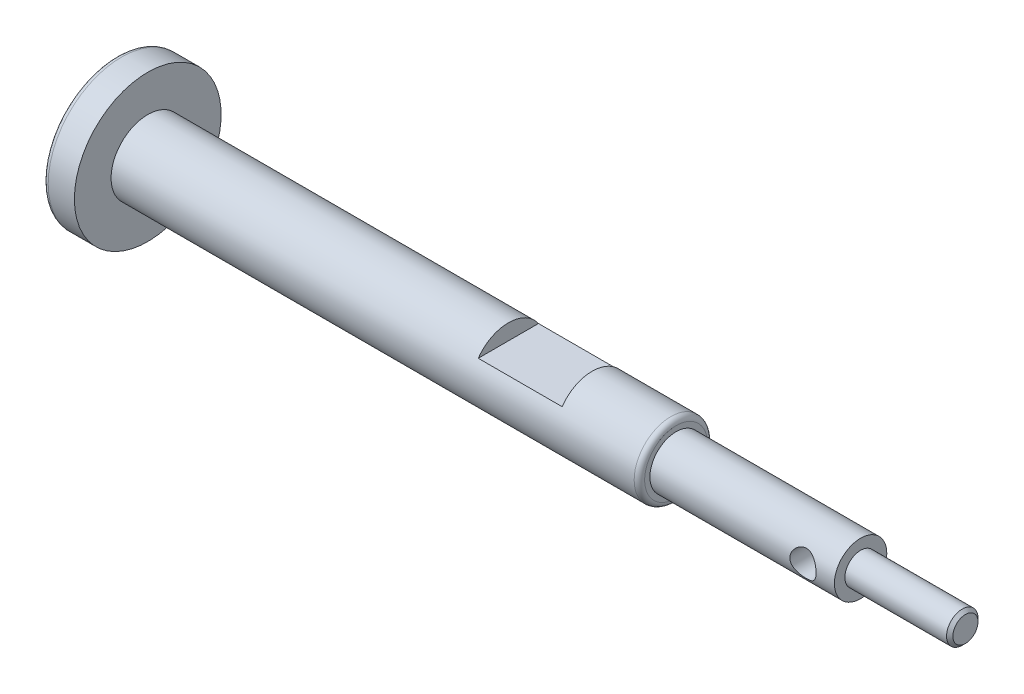
ISO-10303-21;
HEADER;
FILE_DESCRIPTION(('STEP AP214'),'2;1');
FILE_NAME('part.step','',(''),(''),'','','');
FILE_SCHEMA(('AUTOMOTIVE_DESIGN { 1 0 10303 214 1 1 1 1 }'));
ENDSEC;
DATA;
#1=APPLICATION_CONTEXT('core data for automotive mechanical design processes');
#2=APPLICATION_PROTOCOL_DEFINITION('international standard','automotive_design',2000,#1);
#3=PRODUCT_CONTEXT('',#1,'mechanical');
#4=PRODUCT('Part','Part','',(#3));
#5=PRODUCT_RELATED_PRODUCT_CATEGORY('part','',(#4));
#6=PRODUCT_DEFINITION_FORMATION('','',#4);
#7=PRODUCT_DEFINITION_CONTEXT('part definition',#1,'design');
#8=PRODUCT_DEFINITION('design','',#6,#7);
#9=PRODUCT_DEFINITION_SHAPE('','',#8);
#10=(LENGTH_UNIT() NAMED_UNIT(*) SI_UNIT(.MILLI.,.METRE.));
#11=(NAMED_UNIT(*) PLANE_ANGLE_UNIT() SI_UNIT($,.RADIAN.));
#12=(NAMED_UNIT(*) SI_UNIT($,.STERADIAN.) SOLID_ANGLE_UNIT());
#13=UNCERTAINTY_MEASURE_WITH_UNIT(LENGTH_MEASURE(1.E-05),#10,'distance_accuracy_value','');
#14=(GEOMETRIC_REPRESENTATION_CONTEXT(3) GLOBAL_UNCERTAINTY_ASSIGNED_CONTEXT((#13)) GLOBAL_UNIT_ASSIGNED_CONTEXT((#10,
#11,#12)) REPRESENTATION_CONTEXT('',''));
#15=CARTESIAN_POINT('',(0.,0.,0.));
#16=DIRECTION('',(0.,0.,1.));
#17=DIRECTION('',(1.,0.,0.));
#18=AXIS2_PLACEMENT_3D('',#15,#16,#17);
#19=CARTESIAN_POINT('',(68.,0.,0.));
#20=DIRECTION('',(1.,0.,0.));
#21=DIRECTION('',(0.,0.,-1.));
#22=AXIS2_PLACEMENT_3D('',#19,#20,#21);
#23=CYLINDRICAL_SURFACE('',#22,1.5);
#24=CARTESIAN_POINT('',(77.7,0.,0.));
#25=DIRECTION('',(1.,0.,0.));
#26=DIRECTION('',(0.,0.,-1.));
#27=AXIS2_PLACEMENT_3D('',#24,#25,#26);
#28=CIRCLE('',#27,1.5);
#29=CARTESIAN_POINT('',(77.7,0.,-1.5));
#30=VERTEX_POINT('',#29);
#31=EDGE_CURVE('E42',#30,#30,#28,.F.);
#32=ORIENTED_EDGE('',*,*,#31,.T.);
#33=EDGE_LOOP('',(#32));
#34=FACE_BOUND('',#33,.T.);
#35=CARTESIAN_POINT('',(68.,0.,0.));
#36=DIRECTION('',(1.,0.,0.));
#37=DIRECTION('',(0.,0.,-1.));
#38=AXIS2_PLACEMENT_3D('',#35,#36,#37);
#39=CIRCLE('',#38,1.5);
#40=CARTESIAN_POINT('',(68.,0.,-1.5));
#41=VERTEX_POINT('',#40);
#42=EDGE_CURVE('E137',#41,#41,#39,.T.);
#43=ORIENTED_EDGE('',*,*,#42,.T.);
#44=EDGE_LOOP('',(#43));
#45=FACE_BOUND('',#44,.T.);
#46=ADVANCED_FACE('F34',(#34,#45),#23,.T.);
#47=CARTESIAN_POINT('',(34.4,0.,0.));
#48=DIRECTION('',(-1.,0.,0.));
#49=DIRECTION('',(0.,0.,1.));
#50=AXIS2_PLACEMENT_3D('',#47,#48,#49);
#51=CYLINDRICAL_SURFACE('',#50,2.5);
#52=CARTESIAN_POINT('',(66.25,0.,2.5));
#53=CARTESIAN_POINT('',(66.2499958721006,0.0657149536912323,2.49999641755188));
#54=CARTESIAN_POINT('',(66.2447874085979,0.131508249622539,2.49738113774397));
#55=CARTESIAN_POINT('',(66.2241838995739,0.26115029408553,2.48717695046745));
#56=CARTESIAN_POINT('',(66.2087695087529,0.324995108391878,2.47957859786229));
#57=CARTESIAN_POINT('',(66.168507739229,0.448666931100717,2.46020349254139));
#58=CARTESIAN_POINT('',(66.14369701969,0.508508503673975,2.448442989719));
#59=CARTESIAN_POINT('',(66.0855367232938,0.623090771008206,2.42182220644723));
#60=CARTESIAN_POINT('',(66.0521878196889,0.677831867487562,2.40696217041912));
#61=CARTESIAN_POINT('',(65.9756034381434,0.784384772202402,2.37445322822571));
#62=CARTESIAN_POINT('',(65.9318919009504,0.835819013902647,2.35668998909419));
#63=CARTESIAN_POINT('',(65.8368481509412,0.930974306083727,2.3207496280843));
#64=CARTESIAN_POINT('',(65.7855101852845,0.974689478883458,2.30257220261294));
#65=CARTESIAN_POINT('',(65.6718958130958,1.05656500056284,2.26623688996684));
#66=CARTESIAN_POINT('',(65.6090798770676,1.09403166943954,2.24818983712665));
#67=CARTESIAN_POINT('',(65.4770408300172,1.15771028361336,2.21607473465401));
#68=CARTESIAN_POINT('',(65.4078223390966,1.18393026870791,2.20200384508737));
#69=CARTESIAN_POINT('',(65.2691686182226,1.22266555273573,2.1807233379726));
#70=CARTESIAN_POINT('',(65.1999944349158,1.23590732135055,2.17315339479642));
#71=CARTESIAN_POINT('',(65.0600264527756,1.25053374163606,2.1647736243566));
#72=CARTESIAN_POINT('',(64.989234323911,1.25193011046634,2.1639571167911));
#73=CARTESIAN_POINT('',(64.8571424696058,1.24335910896537,2.1688866282156));
#74=CARTESIAN_POINT('',(64.7957199609712,1.23473069942102,2.17385954577517));
#75=CARTESIAN_POINT('',(64.6753476132837,1.20867481132116,2.18845285917313));
#76=CARTESIAN_POINT('',(64.6163985683684,1.19124452987206,2.1980747353972));
#77=CARTESIAN_POINT('',(64.5009635842929,1.1477622254825,2.22109345515926));
#78=CARTESIAN_POINT('',(64.4445670015178,1.12151883389499,2.23457300829998));
#79=CARTESIAN_POINT('',(64.3367071342625,1.061302109585,2.26379255351755));
#80=CARTESIAN_POINT('',(64.2852460804999,1.02732530476558,2.27953355975238));
#81=CARTESIAN_POINT('',(64.181848434071,0.947582568640977,2.31391447379107));
#82=CARTESIAN_POINT('',(64.1306789080298,0.900868072961592,2.33266887795933));
#83=CARTESIAN_POINT('',(64.0365807267614,0.799444473426707,2.36934529125509));
#84=CARTESIAN_POINT('',(63.9936560099576,0.744731570717849,2.38726689948501));
#85=CARTESIAN_POINT('',(63.9153929237128,0.625645632289804,2.42127484103705));
#86=CARTESIAN_POINT('',(63.8804994094428,0.560941989499253,2.43723730202509));
#87=CARTESIAN_POINT('',(63.8223787136962,0.425582769360988,2.46447351401553));
#88=CARTESIAN_POINT('',(63.799142268731,0.35493197033159,2.47575098679441));
#89=CARTESIAN_POINT('',(63.7669057453542,0.215958114575874,2.49155417176795));
#90=CARTESIAN_POINT('',(63.7568859553165,0.147926913185402,2.49656172876639));
#91=CARTESIAN_POINT('',(63.7481690860819,0.0109744999366893,2.50091266823877));
#92=CARTESIAN_POINT('',(63.7494666429507,-0.057946274837379,2.5002587340164));
#93=CARTESIAN_POINT('',(63.7627583605234,-0.189041214982493,2.49363990316801));
#94=CARTESIAN_POINT('',(63.7739156659125,-0.251324260062443,2.48809057110237));
#95=CARTESIAN_POINT('',(63.8052975898689,-0.373008615377396,2.47277714143523));
#96=CARTESIAN_POINT('',(63.8255232080667,-0.432409607113748,2.46301257917915));
#97=CARTESIAN_POINT('',(63.8749980830415,-0.548610760562083,2.43980314267087));
#98=CARTESIAN_POINT('',(63.904488812646,-0.605287996257691,2.42626102212424));
#99=CARTESIAN_POINT('',(63.9713844195576,-0.713076702123651,2.39679967896386));
#100=CARTESIAN_POINT('',(64.0087926682418,-0.764185787219105,2.38087944457231));
#101=CARTESIAN_POINT('',(64.0947005316661,-0.864709611613319,2.3463527667183));
#102=CARTESIAN_POINT('',(64.143928585567,-0.913465097280798,2.32763606060551));
#103=CARTESIAN_POINT('',(64.2499064390866,-1.00232040139155,2.29077989504843));
#104=CARTESIAN_POINT('',(64.3066613985205,-1.04241423211355,2.27264084226908));
#105=CARTESIAN_POINT('',(64.4295545677504,-1.11463489312212,2.23813990282585));
#106=CARTESIAN_POINT('',(64.4960140827607,-1.14628186984829,2.2219066207934));
#107=CARTESIAN_POINT('',(64.6343875846156,-1.19760353251725,2.19467590460158));
#108=CARTESIAN_POINT('',(64.7062944081265,-1.21729364485946,2.18367172800773));
#109=CARTESIAN_POINT('',(64.8461377785768,-1.24232710931209,2.16951876260833));
#110=CARTESIAN_POINT('',(64.9137928167863,-1.24886624550108,2.16571729325614));
#111=CARTESIAN_POINT('',(65.0493088339634,-1.25086144297598,2.16456693307719));
#112=CARTESIAN_POINT('',(65.1171697109243,-1.2463223082805,2.16721524534441));
#113=CARTESIAN_POINT('',(65.244354376915,-1.22740765699033,2.17797327562531));
#114=CARTESIAN_POINT('',(65.3038755876805,-1.2140103929285,2.18553868102992));
#115=CARTESIAN_POINT('',(65.4197601492809,-1.17896919778081,2.20463770234897));
#116=CARTESIAN_POINT('',(65.476122477615,-1.15732261394976,2.21617259462094));
#117=CARTESIAN_POINT('',(65.5882810637332,-1.10476968162586,2.2428566295566));
#118=CARTESIAN_POINT('',(65.6437848772871,-1.07333892227057,2.25819652995238));
#119=CARTESIAN_POINT('',(65.7490931702257,-1.00268871454579,2.29044164543238));
#120=CARTESIAN_POINT('',(65.7988946631481,-0.963465214048306,2.30734767243152));
#121=CARTESIAN_POINT('',(65.897677477947,-0.872754158330796,2.34327903949141));
#122=CARTESIAN_POINT('',(65.9458238779524,-0.820355528762708,2.36231229139336));
#123=CARTESIAN_POINT('',(66.0328287292795,-0.707693507775342,2.3984719031886));
#124=CARTESIAN_POINT('',(66.0716821742829,-0.647425904070972,2.4155972326005));
#125=CARTESIAN_POINT('',(66.1390454534528,-0.519914496024925,2.44622511981379));
#126=CARTESIAN_POINT('',(66.1674802117643,-0.452624379918262,2.45970120703636));
#127=CARTESIAN_POINT('',(66.2122602098987,-0.313427626617736,2.48126676704332));
#128=CARTESIAN_POINT('',(66.228639808537,-0.241534749528955,2.48937154216165));
#129=CARTESIAN_POINT('',(66.2423717638448,-0.140752433104228,2.49619327387079));
#130=CARTESIAN_POINT('',(66.2452283010795,-0.112702349299371,2.49761706674002));
#131=CARTESIAN_POINT('',(66.249043331896,-0.0564396647589458,2.49952121222331));
#132=CARTESIAN_POINT('',(66.250001773089,-0.0282270595592261,2.50000153879704));
#133=CARTESIAN_POINT('',(66.25,0.,2.5));
#134=B_SPLINE_CURVE_WITH_KNOTS('',3,(#52,#53,#54,#55,#56,#57,#58,#59,#60,#61,#62,#63,#64,#65,
#66,#67,#68,#69,#70,#71,#72,#73,#74,#75,#76,#77,#78,#79,#80,#81,#82,#83,#84,#85,#86,#87,#88,#89,
#90,#91,#92,#93,#94,#95,#96,#97,#98,#99,#100,#101,#102,#103,#104,#105,#106,#107,#108,#109,#110,
#111,#112,#113,#114,#115,#116,#117,#118,#119,#120,#121,#122,#123,#124,#125,#126,#127,#128,#129,
#130,#131,#132,#133),.UNSPECIFIED.,.T.,.F.,(4,2,2,2,2,2,2,2,2,2,2,2,2,2,2,2,2,2,2,2,2,2,2,2,2,2,
2,2,2,2,2,2,2,2,2,2,2,2,2,2,4),(0.,0.197030321775364,0.394435187136498,0.591077694365371,
0.787704700726962,0.996227198397629,1.20490779706754,1.4297715803844,1.6544743487285,
1.86572515175289,2.07676696661275,2.2625714051165,2.44843504907097,2.63862800210609,
2.82890651575277,3.04331176667348,3.25781918248358,3.48228777768051,3.70657771140349,
3.91229113089181,4.11790705639344,4.30758633132651,4.49728652038664,4.69241070034872,
4.88761813435423,5.10199513305523,5.31651985769288,5.54143352699588,5.76605639925971,
5.96911634372963,6.17208824825005,6.35572412805227,6.53941910979595,6.73545570969517,
6.93159451423695,7.15156553440623,7.37165479220715,7.59330017078655,7.81431135781161,
7.8989410017212,7.98357298143557),.UNSPECIFIED.);
#135=CARTESIAN_POINT('',(66.25,0.,2.5));
#136=VERTEX_POINT('',#135);
#137=EDGE_CURVE('E108',#136,#136,#134,.T.);
#138=ORIENTED_EDGE('',*,*,#137,.F.);
#139=EDGE_LOOP('',(#138));
#140=FACE_BOUND('',#139,.T.);
#141=CARTESIAN_POINT('',(66.25,0.,-2.5));
#142=CARTESIAN_POINT('',(66.2499958721006,-0.0657149536912323,-2.49999641755188));
#143=CARTESIAN_POINT('',(66.2447874085979,-0.131508249622539,-2.49738113774397));
#144=CARTESIAN_POINT('',(66.2241838995739,-0.26115029408553,-2.48717695046745));
#145=CARTESIAN_POINT('',(66.2087695087529,-0.324995108391878,-2.47957859786229));
#146=CARTESIAN_POINT('',(66.168507739229,-0.448666931100717,-2.46020349254139));
#147=CARTESIAN_POINT('',(66.14369701969,-0.508508503673975,-2.448442989719));
#148=CARTESIAN_POINT('',(66.0855367232938,-0.623090771008206,-2.42182220644723));
#149=CARTESIAN_POINT('',(66.0521878196889,-0.677831867487562,-2.40696217041912));
#150=CARTESIAN_POINT('',(65.9756034381434,-0.784384772202402,-2.37445322822571));
#151=CARTESIAN_POINT('',(65.9318919009504,-0.835819013902647,-2.35668998909419));
#152=CARTESIAN_POINT('',(65.8368481509412,-0.930974306083727,-2.3207496280843));
#153=CARTESIAN_POINT('',(65.7855101852845,-0.974689478883458,-2.30257220261294));
#154=CARTESIAN_POINT('',(65.6718958130958,-1.05656500056284,-2.26623688996684));
#155=CARTESIAN_POINT('',(65.6090798770676,-1.09403166943954,-2.24818983712665));
#156=CARTESIAN_POINT('',(65.4770408300172,-1.15771028361336,-2.21607473465401));
#157=CARTESIAN_POINT('',(65.4078223390966,-1.18393026870791,-2.20200384508737));
#158=CARTESIAN_POINT('',(65.2691686182226,-1.22266555273573,-2.1807233379726));
#159=CARTESIAN_POINT('',(65.1999944349158,-1.23590732135055,-2.17315339479642));
#160=CARTESIAN_POINT('',(65.0600264527756,-1.25053374163606,-2.1647736243566));
#161=CARTESIAN_POINT('',(64.989234323911,-1.25193011046634,-2.1639571167911));
#162=CARTESIAN_POINT('',(64.8571424696058,-1.24335910896537,-2.1688866282156));
#163=CARTESIAN_POINT('',(64.7957199609712,-1.23473069942102,-2.17385954577517));
#164=CARTESIAN_POINT('',(64.6753476132837,-1.20867481132116,-2.18845285917313));
#165=CARTESIAN_POINT('',(64.6163985683684,-1.19124452987206,-2.1980747353972));
#166=CARTESIAN_POINT('',(64.5009635842929,-1.1477622254825,-2.22109345515926));
#167=CARTESIAN_POINT('',(64.4445670015178,-1.12151883389499,-2.23457300829998));
#168=CARTESIAN_POINT('',(64.3367071342625,-1.061302109585,-2.26379255351755));
#169=CARTESIAN_POINT('',(64.2852460804999,-1.02732530476558,-2.27953355975238));
#170=CARTESIAN_POINT('',(64.181848434071,-0.947582568640977,-2.31391447379107));
#171=CARTESIAN_POINT('',(64.1306789080298,-0.900868072961592,-2.33266887795933));
#172=CARTESIAN_POINT('',(64.0365807267614,-0.799444473426707,-2.36934529125509));
#173=CARTESIAN_POINT('',(63.9936560099576,-0.744731570717849,-2.38726689948501));
#174=CARTESIAN_POINT('',(63.9153929237128,-0.625645632289804,-2.42127484103705));
#175=CARTESIAN_POINT('',(63.8804994094428,-0.560941989499253,-2.43723730202509));
#176=CARTESIAN_POINT('',(63.8223787136962,-0.425582769360988,-2.46447351401553));
#177=CARTESIAN_POINT('',(63.799142268731,-0.35493197033159,-2.47575098679441));
#178=CARTESIAN_POINT('',(63.7669057453542,-0.215958114575874,-2.49155417176795));
#179=CARTESIAN_POINT('',(63.7568859553165,-0.147926913185402,-2.49656172876639));
#180=CARTESIAN_POINT('',(63.7481690860819,-0.0109744999366893,-2.50091266823877));
#181=CARTESIAN_POINT('',(63.7494666429507,0.057946274837379,-2.5002587340164));
#182=CARTESIAN_POINT('',(63.7627583605234,0.189041214982493,-2.49363990316801));
#183=CARTESIAN_POINT('',(63.7739156659125,0.251324260062443,-2.48809057110237));
#184=CARTESIAN_POINT('',(63.8052975898689,0.373008615377396,-2.47277714143523));
#185=CARTESIAN_POINT('',(63.8255232080667,0.432409607113748,-2.46301257917915));
#186=CARTESIAN_POINT('',(63.8749980830415,0.548610760562083,-2.43980314267087));
#187=CARTESIAN_POINT('',(63.904488812646,0.605287996257691,-2.42626102212424));
#188=CARTESIAN_POINT('',(63.9713844195576,0.713076702123651,-2.39679967896386));
#189=CARTESIAN_POINT('',(64.0087926682418,0.764185787219105,-2.38087944457231));
#190=CARTESIAN_POINT('',(64.0947005316661,0.864709611613319,-2.3463527667183));
#191=CARTESIAN_POINT('',(64.143928585567,0.913465097280798,-2.32763606060551));
#192=CARTESIAN_POINT('',(64.2499064390866,1.00232040139155,-2.29077989504843));
#193=CARTESIAN_POINT('',(64.3066613985205,1.04241423211355,-2.27264084226908));
#194=CARTESIAN_POINT('',(64.4295545677504,1.11463489312212,-2.23813990282585));
#195=CARTESIAN_POINT('',(64.4960140827607,1.14628186984829,-2.2219066207934));
#196=CARTESIAN_POINT('',(64.6343875846156,1.19760353251725,-2.19467590460158));
#197=CARTESIAN_POINT('',(64.7062944081265,1.21729364485946,-2.18367172800773));
#198=CARTESIAN_POINT('',(64.8461377785768,1.24232710931209,-2.16951876260833));
#199=CARTESIAN_POINT('',(64.9137928167863,1.24886624550108,-2.16571729325614));
#200=CARTESIAN_POINT('',(65.0493088339634,1.25086144297598,-2.16456693307719));
#201=CARTESIAN_POINT('',(65.1171697109243,1.2463223082805,-2.16721524534441));
#202=CARTESIAN_POINT('',(65.244354376915,1.22740765699033,-2.17797327562531));
#203=CARTESIAN_POINT('',(65.3038755876805,1.2140103929285,-2.18553868102992));
#204=CARTESIAN_POINT('',(65.4197601492809,1.17896919778081,-2.20463770234897));
#205=CARTESIAN_POINT('',(65.476122477615,1.15732261394976,-2.21617259462094));
#206=CARTESIAN_POINT('',(65.5882810637332,1.10476968162586,-2.2428566295566));
#207=CARTESIAN_POINT('',(65.6437848772871,1.07333892227057,-2.25819652995238));
#208=CARTESIAN_POINT('',(65.7490931702257,1.00268871454579,-2.29044164543238));
#209=CARTESIAN_POINT('',(65.7988946631481,0.963465214048306,-2.30734767243152));
#210=CARTESIAN_POINT('',(65.897677477947,0.872754158330796,-2.34327903949141));
#211=CARTESIAN_POINT('',(65.9458238779524,0.820355528762708,-2.36231229139336));
#212=CARTESIAN_POINT('',(66.0328287292795,0.707693507775342,-2.3984719031886));
#213=CARTESIAN_POINT('',(66.0716821742829,0.647425904070972,-2.4155972326005));
#214=CARTESIAN_POINT('',(66.1390454534528,0.519914496024925,-2.44622511981379));
#215=CARTESIAN_POINT('',(66.1674802117643,0.452624379918262,-2.45970120703636));
#216=CARTESIAN_POINT('',(66.2122602098987,0.313427626617736,-2.48126676704332));
#217=CARTESIAN_POINT('',(66.228639808537,0.241534749528955,-2.48937154216165));
#218=CARTESIAN_POINT('',(66.2423717638448,0.140752433104228,-2.49619327387079));
#219=CARTESIAN_POINT('',(66.2452283010795,0.112702349299371,-2.49761706674002));
#220=CARTESIAN_POINT('',(66.249043331896,0.0564396647589458,-2.49952121222331));
#221=CARTESIAN_POINT('',(66.250001773089,0.0282270595592261,-2.50000153879704));
#222=CARTESIAN_POINT('',(66.25,0.,-2.5));
#223=B_SPLINE_CURVE_WITH_KNOTS('',3,(#141,#142,#143,#144,#145,#146,#147,#148,#149,#150,#151,
#152,#153,#154,#155,#156,#157,#158,#159,#160,#161,#162,#163,#164,#165,#166,#167,#168,#169,#170,
#171,#172,#173,#174,#175,#176,#177,#178,#179,#180,#181,#182,#183,#184,#185,#186,#187,#188,#189,
#190,#191,#192,#193,#194,#195,#196,#197,#198,#199,#200,#201,#202,#203,#204,#205,#206,#207,#208,
#209,#210,#211,#212,#213,#214,#215,#216,#217,#218,#219,#220,#221,#222),.UNSPECIFIED.,.T.,.F.,(4,
2,2,2,2,2,2,2,2,2,2,2,2,2,2,2,2,2,2,2,2,2,2,2,2,2,2,2,2,2,2,2,2,2,2,2,2,2,2,2,4),(0.,
0.197030321775364,0.394435187136498,0.591077694365371,0.787704700726962,0.996227198397629,
1.20490779706754,1.4297715803844,1.6544743487285,1.86572515175289,2.07676696661275,
2.2625714051165,2.44843504907097,2.63862800210609,2.82890651575277,3.04331176667348,
3.25781918248358,3.48228777768051,3.70657771140349,3.91229113089181,4.11790705639344,
4.30758633132651,4.49728652038664,4.69241070034872,4.88761813435423,5.10199513305523,
5.31651985769288,5.54143352699588,5.76605639925971,5.96911634372963,6.17208824825005,
6.35572412805227,6.53941910979595,6.73545570969517,6.93159451423695,7.15156553440623,
7.37165479220715,7.59330017078655,7.81431135781161,7.8989410017212,7.98357298143557),.UNSPECIFIED.);
#224=CARTESIAN_POINT('',(66.25,0.,-2.5));
#225=VERTEX_POINT('',#224);
#226=EDGE_CURVE('E101',#225,#225,#223,.T.);
#227=ORIENTED_EDGE('',*,*,#226,.F.);
#228=EDGE_LOOP('',(#227));
#229=FACE_BOUND('',#228,.T.);
#230=CARTESIAN_POINT('',(50.4,0.,0.));
#231=DIRECTION('',(-1.,0.,0.));
#232=DIRECTION('',(0.,0.,1.));
#233=AXIS2_PLACEMENT_3D('',#230,#231,#232);
#234=CIRCLE('',#233,2.5);
#235=CARTESIAN_POINT('',(50.4,0.,2.5));
#236=VERTEX_POINT('',#235);
#237=EDGE_CURVE('E81',#236,#236,#234,.T.);
#238=ORIENTED_EDGE('',*,*,#237,.F.);
#239=EDGE_LOOP('',(#238));
#240=FACE_BOUND('',#239,.T.);
#241=CARTESIAN_POINT('',(68.,0.,0.));
#242=DIRECTION('',(1.,0.,0.));
#243=DIRECTION('',(0.,0.,-1.));
#244=AXIS2_PLACEMENT_3D('',#241,#242,#243);
#245=CIRCLE('',#244,2.5);
#246=CARTESIAN_POINT('',(68.,0.,-2.5));
#247=VERTEX_POINT('',#246);
#248=EDGE_CURVE('E140',#247,#247,#245,.T.);
#249=ORIENTED_EDGE('',*,*,#248,.F.);
#250=EDGE_LOOP('',(#249));
#251=FACE_BOUND('',#250,.T.);
#252=ADVANCED_FACE('F111',(#140,#229,#240,#251),#51,.T.);
#253=CARTESIAN_POINT('',(90.,0.,0.));
#254=DIRECTION('',(-1.,0.,0.));
#255=DIRECTION('',(0.,0.,1.));
#256=AXIS2_PLACEMENT_3D('',#253,#254,#255);
#257=CYLINDRICAL_SURFACE('',#256,3.5);
#258=CARTESIAN_POINT('',(49.9,0.,0.));
#259=DIRECTION('',(1.,0.,0.));
#260=DIRECTION('',(0.,0.,-1.));
#261=AXIS2_PLACEMENT_3D('',#258,#259,#260);
#262=CIRCLE('',#261,3.5);
#263=CARTESIAN_POINT('',(49.9,0.,-3.5));
#264=VERTEX_POINT('',#263);
#265=EDGE_CURVE('E73',#264,#264,#262,.F.);
#266=ORIENTED_EDGE('',*,*,#265,.T.);
#267=EDGE_LOOP('',(#266));
#268=FACE_BOUND('',#267,.T.);
#269=CARTESIAN_POINT('',(0.,0.,0.));
#270=DIRECTION('',(-1.,0.,0.));
#271=DIRECTION('',(0.,0.,1.));
#272=AXIS2_PLACEMENT_3D('',#269,#270,#271);
#273=CIRCLE('',#272,3.5);
#274=CARTESIAN_POINT('',(0.,0.,3.5));
#275=VERTEX_POINT('',#274);
#276=EDGE_CURVE('E79',#275,#275,#273,.T.);
#277=ORIENTED_EDGE('',*,*,#276,.F.);
#278=EDGE_LOOP('',(#277));
#279=FACE_BOUND('',#278,.T.);
#280=CARTESIAN_POINT('',(42.4,0.,0.));
#281=DIRECTION('',(1.,0.,0.));
#282=DIRECTION('',(0.,1.,0.));
#283=AXIS2_PLACEMENT_3D('',#280,#281,#282);
#284=CIRCLE('',#283,3.5);
#285=CARTESIAN_POINT('',(42.4,2.,-2.87228132326901));
#286=VERTEX_POINT('',#285);
#287=CARTESIAN_POINT('',(42.4,2.,2.87228132326901));
#288=VERTEX_POINT('',#287);
#289=EDGE_CURVE('E65',#286,#288,#284,.T.);
#290=ORIENTED_EDGE('',*,*,#289,.T.);
#291=DIRECTION('',(-1.,0.,0.));
#292=VECTOR('',#291,1.);
#293=CARTESIAN_POINT('',(90.,2.,2.87228132326901));
#294=LINE('',#293,#292);
#295=CARTESIAN_POINT('',(34.4,2.,2.87228132326901));
#296=VERTEX_POINT('',#295);
#297=EDGE_CURVE('E67',#288,#296,#294,.T.);
#298=ORIENTED_EDGE('',*,*,#297,.T.);
#299=CARTESIAN_POINT('',(34.4,0.,0.));
#300=DIRECTION('',(-1.,0.,0.));
#301=DIRECTION('',(0.,0.,1.));
#302=AXIS2_PLACEMENT_3D('',#299,#300,#301);
#303=CIRCLE('',#302,3.5);
#304=CARTESIAN_POINT('',(34.4,2.,-2.87228132326901));
#305=VERTEX_POINT('',#304);
#306=EDGE_CURVE('E56',#296,#305,#303,.T.);
#307=ORIENTED_EDGE('',*,*,#306,.T.);
#308=DIRECTION('',(-1.,0.,0.));
#309=VECTOR('',#308,1.);
#310=CARTESIAN_POINT('',(90.,2.,-2.87228132326901));
#311=LINE('',#310,#309);
#312=EDGE_CURVE('E68',#305,#286,#311,.F.);
#313=ORIENTED_EDGE('',*,*,#312,.T.);
#314=EDGE_LOOP('',(#290,#298,#307,#313));
#315=FACE_BOUND('',#314,.T.);
#316=ADVANCED_FACE('F66',(#268,#279,#315),#257,.T.);
#317=CARTESIAN_POINT('',(0.,0.,0.));
#318=DIRECTION('',(-1.,0.,0.));
#319=DIRECTION('',(0.,0.,1.));
#320=AXIS2_PLACEMENT_3D('',#317,#318,#319);
#321=PLANE('',#320);
#322=CARTESIAN_POINT('',(0.,0.,0.));
#323=DIRECTION('',(-1.,0.,0.));
#324=DIRECTION('',(0.,0.,1.));
#325=AXIS2_PLACEMENT_3D('',#322,#323,#324);
#326=CIRCLE('',#325,7.);
#327=CARTESIAN_POINT('',(0.,0.,7.));
#328=VERTEX_POINT('',#327);
#329=EDGE_CURVE('E76',#328,#328,#326,.T.);
#330=ORIENTED_EDGE('',*,*,#329,.F.);
#331=EDGE_LOOP('',(#330));
#332=FACE_BOUND('',#331,.T.);
#333=ORIENTED_EDGE('',*,*,#276,.T.);
#334=EDGE_LOOP('',(#333));
#335=FACE_BOUND('',#334,.T.);
#336=ADVANCED_FACE('F173',(#332,#335),#321,.F.);
#337=CARTESIAN_POINT('',(-3.,0.,0.));
#338=DIRECTION('',(1.,0.,0.));
#339=DIRECTION('',(0.,0.,-1.));
#340=AXIS2_PLACEMENT_3D('',#337,#338,#339);
#341=CYLINDRICAL_SURFACE('',#340,7.);
#342=CARTESIAN_POINT('',(-2.5,0.,0.));
#343=DIRECTION('',(-1.,0.,0.));
#344=DIRECTION('',(0.,0.,1.));
#345=AXIS2_PLACEMENT_3D('',#342,#343,#344);
#346=CIRCLE('',#345,7.);
#347=CARTESIAN_POINT('',(-2.5,0.,7.));
#348=VERTEX_POINT('',#347);
#349=EDGE_CURVE('E91',#348,#348,#346,.F.);
#350=ORIENTED_EDGE('',*,*,#349,.T.);
#351=EDGE_LOOP('',(#350));
#352=FACE_BOUND('',#351,.T.);
#353=ORIENTED_EDGE('',*,*,#329,.T.);
#354=EDGE_LOOP('',(#353));
#355=FACE_BOUND('',#354,.T.);
#356=ADVANCED_FACE('F171',(#352,#355),#341,.T.);
#357=CARTESIAN_POINT('',(-3.,0.,0.));
#358=DIRECTION('',(-1.,0.,0.));
#359=DIRECTION('',(0.,0.,1.));
#360=AXIS2_PLACEMENT_3D('',#357,#358,#359);
#361=PLANE('',#360);
#362=CARTESIAN_POINT('',(-3.,0.,0.));
#363=DIRECTION('',(-1.,0.,0.));
#364=DIRECTION('',(0.,0.,1.));
#365=AXIS2_PLACEMENT_3D('',#362,#363,#364);
#366=CIRCLE('',#365,6.5);
#367=CARTESIAN_POINT('',(-3.,0.,6.5));
#368=VERTEX_POINT('',#367);
#369=EDGE_CURVE('E88',#368,#368,#366,.T.);
#370=ORIENTED_EDGE('',*,*,#369,.T.);
#371=EDGE_LOOP('',(#370));
#372=FACE_BOUND('',#371,.T.);
#373=ADVANCED_FACE('F168',(#372),#361,.T.);
#374=CARTESIAN_POINT('',(-2.5,0.,0.));
#375=DIRECTION('',(-1.,0.,0.));
#376=DIRECTION('',(0.,0.,1.));
#377=AXIS2_PLACEMENT_3D('',#374,#375,#376);
#378=TOROIDAL_SURFACE('',#377,6.5,0.5);
#379=ORIENTED_EDGE('',*,*,#349,.F.);
#380=EDGE_LOOP('',(#379));
#381=FACE_BOUND('',#380,.T.);
#382=ORIENTED_EDGE('',*,*,#369,.F.);
#383=EDGE_LOOP('',(#382));
#384=FACE_BOUND('',#383,.T.);
#385=ADVANCED_FACE('F167',(#381,#384),#378,.T.);
#386=CARTESIAN_POINT('',(34.4,2.,-7.));
#387=DIRECTION('',(-1.,0.,0.));
#388=DIRECTION('',(0.,0.,1.));
#389=AXIS2_PLACEMENT_3D('',#386,#387,#388);
#390=PLANE('',#389);
#391=DIRECTION('',(0.,0.,1.));
#392=VECTOR('',#391,1.);
#393=CARTESIAN_POINT('',(34.4,2.,-7.));
#394=LINE('',#393,#392);
#395=EDGE_CURVE('E72',#305,#296,#394,.T.);
#396=ORIENTED_EDGE('',*,*,#395,.F.);
#397=ORIENTED_EDGE('',*,*,#306,.F.);
#398=EDGE_LOOP('',(#396,#397));
#399=FACE_BOUND('',#398,.T.);
#400=ADVANCED_FACE('F163',(#399),#390,.F.);
#401=CARTESIAN_POINT('',(42.4,2.,-7.));
#402=DIRECTION('',(1.,0.,0.));
#403=DIRECTION('',(0.,1.,0.));
#404=AXIS2_PLACEMENT_3D('',#401,#402,#403);
#405=PLANE('',#404);
#406=ORIENTED_EDGE('',*,*,#289,.F.);
#407=DIRECTION('',(0.,0.,1.));
#408=VECTOR('',#407,1.);
#409=CARTESIAN_POINT('',(42.4,2.,-7.));
#410=LINE('',#409,#408);
#411=EDGE_CURVE('E49',#286,#288,#410,.T.);
#412=ORIENTED_EDGE('',*,*,#411,.T.);
#413=EDGE_LOOP('',(#406,#412));
#414=FACE_BOUND('',#413,.T.);
#415=ADVANCED_FACE('F75',(#414),#405,.F.);
#416=CARTESIAN_POINT('',(42.4,2.,-7.));
#417=DIRECTION('',(0.,-1.,0.));
#418=DIRECTION('',(1.,0.,0.));
#419=AXIS2_PLACEMENT_3D('',#416,#417,#418);
#420=PLANE('',#419);
#421=ORIENTED_EDGE('',*,*,#411,.F.);
#422=ORIENTED_EDGE('',*,*,#312,.F.);
#423=ORIENTED_EDGE('',*,*,#395,.T.);
#424=ORIENTED_EDGE('',*,*,#297,.F.);
#425=EDGE_LOOP('',(#421,#422,#423,#424));
#426=FACE_BOUND('',#425,.T.);
#427=ADVANCED_FACE('F71',(#426),#420,.F.);
#428=CARTESIAN_POINT('',(50.4,2.5,0.));
#429=DIRECTION('',(1.,0.,0.));
#430=DIRECTION('',(0.,0.,-1.));
#431=AXIS2_PLACEMENT_3D('',#428,#429,#430);
#432=PLANE('',#431);
#433=CARTESIAN_POINT('',(50.4,0.,0.));
#434=DIRECTION('',(1.,0.,0.));
#435=DIRECTION('',(0.,0.,-1.));
#436=AXIS2_PLACEMENT_3D('',#433,#434,#435);
#437=CIRCLE('',#436,3.);
#438=CARTESIAN_POINT('',(50.4,0.,-3.));
#439=VERTEX_POINT('',#438);
#440=EDGE_CURVE('E98',#439,#439,#437,.T.);
#441=ORIENTED_EDGE('',*,*,#440,.T.);
#442=EDGE_LOOP('',(#441));
#443=FACE_BOUND('',#442,.T.);
#444=ORIENTED_EDGE('',*,*,#237,.T.);
#445=EDGE_LOOP('',(#444));
#446=FACE_BOUND('',#445,.T.);
#447=ADVANCED_FACE('F132',(#443,#446),#432,.T.);
#448=CARTESIAN_POINT('',(49.9,0.,0.));
#449=DIRECTION('',(1.,0.,0.));
#450=DIRECTION('',(0.,0.,-1.));
#451=AXIS2_PLACEMENT_3D('',#448,#449,#450);
#452=TOROIDAL_SURFACE('',#451,3.,0.5);
#453=ORIENTED_EDGE('',*,*,#440,.F.);
#454=EDGE_LOOP('',(#453));
#455=FACE_BOUND('',#454,.T.);
#456=ORIENTED_EDGE('',*,*,#265,.F.);
#457=EDGE_LOOP('',(#456));
#458=FACE_BOUND('',#457,.T.);
#459=ADVANCED_FACE('F127',(#455,#458),#452,.T.);
#460=CARTESIAN_POINT('',(68.,0.,0.));
#461=DIRECTION('',(1.,0.,0.));
#462=DIRECTION('',(0.,0.,-1.));
#463=AXIS2_PLACEMENT_3D('',#460,#461,#462);
#464=PLANE('',#463);
#465=ORIENTED_EDGE('',*,*,#42,.F.);
#466=EDGE_LOOP('',(#465));
#467=FACE_BOUND('',#466,.T.);
#468=ORIENTED_EDGE('',*,*,#248,.T.);
#469=EDGE_LOOP('',(#468));
#470=FACE_BOUND('',#469,.T.);
#471=ADVANCED_FACE('F121',(#467,#470),#464,.T.);
#472=CARTESIAN_POINT('',(65.,0.,-7.));
#473=DIRECTION('',(0.,0.,1.));
#474=DIRECTION('',(1.,0.,0.));
#475=AXIS2_PLACEMENT_3D('',#472,#473,#474);
#476=CYLINDRICAL_SURFACE('',#475,1.25);
#477=ORIENTED_EDGE('',*,*,#137,.T.);
#478=EDGE_LOOP('',(#477));
#479=FACE_BOUND('',#478,.T.);
#480=ORIENTED_EDGE('',*,*,#226,.T.);
#481=EDGE_LOOP('',(#480));
#482=FACE_BOUND('',#481,.T.);
#483=ADVANCED_FACE('F115',(#479,#482),#476,.F.);
#484=CARTESIAN_POINT('',(78.,0.,0.));
#485=DIRECTION('',(1.,0.,0.));
#486=DIRECTION('',(0.,0.,-1.));
#487=AXIS2_PLACEMENT_3D('',#484,#485,#486);
#488=PLANE('',#487);
#489=CARTESIAN_POINT('',(78.,0.,0.));
#490=DIRECTION('',(1.,0.,0.));
#491=DIRECTION('',(0.,0.,-1.));
#492=AXIS2_PLACEMENT_3D('',#489,#490,#491);
#493=CIRCLE('',#492,1.19999999999998);
#494=CARTESIAN_POINT('',(78.,0.,-1.19999999999998));
#495=VERTEX_POINT('',#494);
#496=EDGE_CURVE('E11',#495,#495,#493,.T.);
#497=ORIENTED_EDGE('',*,*,#496,.T.);
#498=EDGE_LOOP('',(#497));
#499=FACE_BOUND('',#498,.T.);
#500=ADVANCED_FACE('F120',(#499),#488,.T.);
#501=CARTESIAN_POINT('',(77.7,0.,0.));
#502=DIRECTION('',(-1.,0.,0.));
#503=DIRECTION('',(0.,0.,1.));
#504=AXIS2_PLACEMENT_3D('',#501,#502,#503);
#505=CONICAL_SURFACE('',#504,1.5,0.78539816339747);
#506=ORIENTED_EDGE('',*,*,#496,.F.);
#507=EDGE_LOOP('',(#506));
#508=FACE_BOUND('',#507,.T.);
#509=ORIENTED_EDGE('',*,*,#31,.F.);
#510=EDGE_LOOP('',(#509));
#511=FACE_BOUND('',#510,.T.);
#512=ADVANCED_FACE('F36',(#508,#511),#505,.T.);
#513=CLOSED_SHELL('',(#46,#252,#316,#336,#356,#373,#385,#400,#415,#427,#447,#459,#471,#483,#500,#512));
#514=MANIFOLD_SOLID_BREP('B2',#513);
#515=ADVANCED_BREP_SHAPE_REPRESENTATION('',(#18,#514),#14);
#516=SHAPE_DEFINITION_REPRESENTATION(#9,#515);
ENDSEC;
END-ISO-10303-21;
